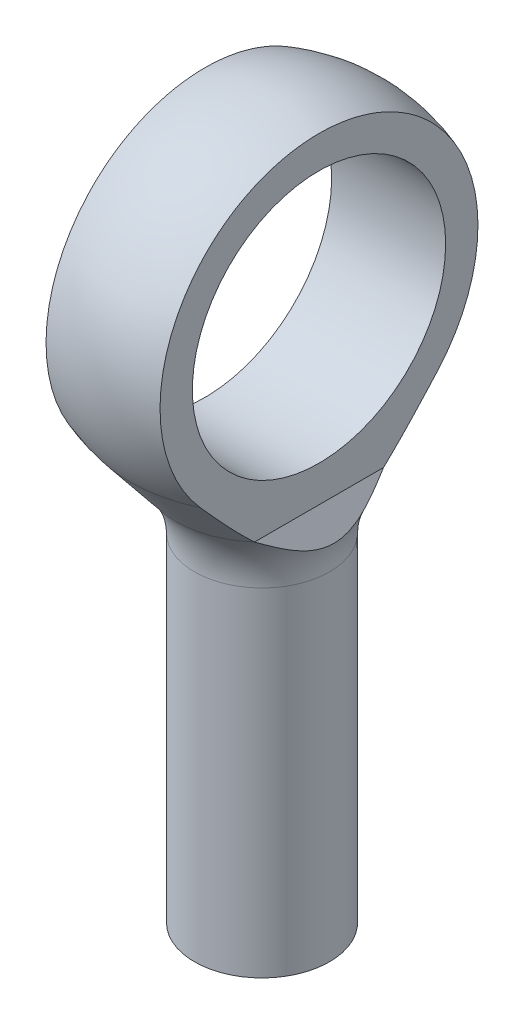
ISO-10303-21;
HEADER;
FILE_DESCRIPTION(('STEP AP214'),'2;1');
FILE_NAME('part.step','',(''),(''),'','','');
FILE_SCHEMA(('AUTOMOTIVE_DESIGN { 1 0 10303 214 1 1 1 1 }'));
ENDSEC;
DATA;
#1=APPLICATION_CONTEXT('core data for automotive mechanical design processes');
#2=APPLICATION_PROTOCOL_DEFINITION('international standard','automotive_design',2000,#1);
#3=PRODUCT_CONTEXT('',#1,'mechanical');
#4=PRODUCT('Part','Part','',(#3));
#5=PRODUCT_RELATED_PRODUCT_CATEGORY('part','',(#4));
#6=PRODUCT_DEFINITION_FORMATION('','',#4);
#7=PRODUCT_DEFINITION_CONTEXT('part definition',#1,'design');
#8=PRODUCT_DEFINITION('design','',#6,#7);
#9=PRODUCT_DEFINITION_SHAPE('','',#8);
#10=(LENGTH_UNIT() NAMED_UNIT(*) SI_UNIT(.MILLI.,.METRE.));
#11=(NAMED_UNIT(*) PLANE_ANGLE_UNIT() SI_UNIT($,.RADIAN.));
#12=(NAMED_UNIT(*) SI_UNIT($,.STERADIAN.) SOLID_ANGLE_UNIT());
#13=UNCERTAINTY_MEASURE_WITH_UNIT(LENGTH_MEASURE(1.E-05),#10,'distance_accuracy_value','');
#14=(GEOMETRIC_REPRESENTATION_CONTEXT(3) GLOBAL_UNCERTAINTY_ASSIGNED_CONTEXT((#13)) GLOBAL_UNIT_ASSIGNED_CONTEXT((#10,
#11,#12)) REPRESENTATION_CONTEXT('',''));
#15=CARTESIAN_POINT('',(0.,0.,0.));
#16=DIRECTION('',(0.,0.,1.));
#17=DIRECTION('',(1.,0.,0.));
#18=AXIS2_PLACEMENT_3D('',#15,#16,#17);
#19=CARTESIAN_POINT('',(0.,20.,0.));
#20=DIRECTION('',(0.,-1.,0.));
#21=DIRECTION('',(0.,0.,-1.));
#22=AXIS2_PLACEMENT_3D('',#19,#20,#21);
#23=TOROIDAL_SURFACE('',#22,9.00000000000001,5.);
#24=CARTESIAN_POINT('',(0.,20.,0.));
#25=DIRECTION('',(0.,-1.,0.));
#26=DIRECTION('',(0.,0.,-1.));
#27=AXIS2_PLACEMENT_3D('',#24,#25,#26);
#28=CIRCLE('',#27,4.);
#29=CARTESIAN_POINT('',(0.,20.,-4.));
#30=VERTEX_POINT('',#29);
#31=EDGE_CURVE('E117',#30,#30,#28,.T.);
#32=ORIENTED_EDGE('',*,*,#31,.F.);
#33=EDGE_LOOP('',(#32));
#34=FACE_BOUND('',#33,.T.);
#35=CARTESIAN_POINT('',(0.,23.1266040101754,0.));
#36=DIRECTION('',(0.,-1.,0.));
#37=DIRECTION('',(0.,0.,-1.));
#38=AXIS2_PLACEMENT_3D('',#35,#36,#37);
#39=CIRCLE('',#38,5.09816102798247);
#40=CARTESIAN_POINT('',(-3.375,23.1266040101754,-3.8210758782363));
#41=VERTEX_POINT('',#40);
#42=CARTESIAN_POINT('',(3.375,23.1266040101754,-3.8210758782363));
#43=VERTEX_POINT('',#42);
#44=EDGE_CURVE('E99',#41,#43,#39,.T.);
#45=ORIENTED_EDGE('',*,*,#44,.T.);
#46=CARTESIAN_POINT('',(3.37488452994616,23.1268040101754,-3.82139169445443));
#47=CARTESIAN_POINT('',(3.41249017782245,23.0616691174022,-3.71851652397559));
#48=CARTESIAN_POINT('',(3.45009264726137,22.9965397298439,-3.61562765823133));
#49=CARTESIAN_POINT('',(3.52489695876208,22.8669748616995,-3.40920546549691));
#50=CARTESIAN_POINT('',(3.56209862787852,22.8025396806634,-3.30567188850496));
#51=CARTESIAN_POINT('',(3.63620425532034,22.6741849688074,-3.09593016847851));
#52=CARTESIAN_POINT('',(3.67309623603228,22.6102861838225,-2.98970497515738));
#53=CARTESIAN_POINT('',(3.7455286134128,22.4848296260864,-2.77543445953144));
#54=CARTESIAN_POINT('',(3.78106917330494,22.4232715706238,-2.66738935932274));
#55=CARTESIAN_POINT('',(3.85199843352389,22.3004184881813,-2.44325946641159));
#56=CARTESIAN_POINT('',(3.88728643457035,22.2392978774713,-2.32704608139777));
#57=CARTESIAN_POINT('',(3.95495503849702,22.122092417393,-2.09120887895792));
#58=CARTESIAN_POINT('',(3.98733493815186,22.0660087860469,-1.97158424580214));
#59=CARTESIAN_POINT('',(4.04804034358767,21.960863939538,-1.72915852017785));
#60=CARTESIAN_POINT('',(4.07638937900855,21.9117619698435,-1.60638125875592));
#61=CARTESIAN_POINT('',(4.12815719037178,21.8220974903657,-1.35677842923676));
#62=CARTESIAN_POINT('',(4.15157995238087,21.7815280765124,-1.22995623052396));
#63=CARTESIAN_POINT('',(4.18730329089335,21.7196534391928,-1.0042557794531));
#64=CARTESIAN_POINT('',(4.20092202565008,21.6960650986593,-0.906214387147233));
#65=CARTESIAN_POINT('',(4.22423689221716,21.6556825651934,-0.708200299966036));
#66=CARTESIAN_POINT('',(4.23393083939658,21.6388921561528,-0.608226561847437));
#67=CARTESIAN_POINT('',(4.24886919463881,21.6130181658917,-0.408523694003785));
#68=CARTESIAN_POINT('',(4.25418002166275,21.6038195436561,-0.308814640528312));
#69=CARTESIAN_POINT('',(4.26036739770318,21.5931026939885,-0.108859294569088));
#70=CARTESIAN_POINT('',(4.26124479024619,21.5915830055258,-0.00861310791666822));
#71=CARTESIAN_POINT('',(4.25852540569128,21.5962931177403,0.191748593784782));
#72=CARTESIAN_POINT('',(4.25492348697454,21.6025318239624,0.291863826376097));
#73=CARTESIAN_POINT('',(4.24339880181696,21.6224931641965,0.491099509379316));
#74=CARTESIAN_POINT('',(4.23547524923607,21.6362171598431,0.590219775456858));
#75=CARTESIAN_POINT('',(4.21548330720657,21.6708442191801,0.788361219680527));
#76=CARTESIAN_POINT('',(4.20335247625208,21.6918554347314,0.88735696676834));
#77=CARTESIAN_POINT('',(4.17544221969617,21.7401974171385,1.08319175936201));
#78=CARTESIAN_POINT('',(4.15966429349354,21.7675255869595,1.18003167328885));
#79=CARTESIAN_POINT('',(4.09891483296068,21.8727467391348,1.51502481873303));
#80=CARTESIAN_POINT('',(4.04565822096029,21.9649898969585,1.74721709218185));
#81=CARTESIAN_POINT('',(3.9564660302895,22.1194753028387,2.08570885380638));
#82=CARTESIAN_POINT('',(3.92508633751298,22.1738265250535,2.19719526072878));
#83=CARTESIAN_POINT('',(3.85994612750983,22.2866526783946,2.41736063382695));
#84=CARTESIAN_POINT('',(3.82618605686691,22.3451268360153,2.52604012141026));
#85=CARTESIAN_POINT('',(3.75863904570073,22.4621216912545,2.73581015913675));
#86=CARTESIAN_POINT('',(3.72493590164482,22.5204972491342,2.83701030853647));
#87=CARTESIAN_POINT('',(3.65641332850057,22.6391818272854,3.03789788982571));
#88=CARTESIAN_POINT('',(3.62159379150606,22.6994910344559,3.13758517410727));
#89=CARTESIAN_POINT('',(3.5516232398074,22.8206835850316,3.33488821335653));
#90=CARTESIAN_POINT('',(3.5164797491661,22.8815538963777,3.43251472101358));
#91=CARTESIAN_POINT('',(3.44585371690543,23.0038817725901,3.62722879866369));
#92=CARTESIAN_POINT('',(3.41037128908788,23.065339140346,3.72431653336598));
#93=CARTESIAN_POINT('',(3.37488452994616,23.1268040101754,3.82139169445443));
#94=B_SPLINE_CURVE_WITH_KNOTS('',3,(#46,#47,#48,#49,#50,#51,#52,#53,#54,#55,#56,#57,#58,#59,#60,
#61,#62,#63,#64,#65,#66,#67,#68,#69,#70,#71,#72,#73,#74,#75,#76,#77,#78,#79,#80,#81,#82,#83,#84,
#85,#86,#87,#88,#89,#90,#91,#92,#93),.UNSPECIFIED.,.F.,.F.,(4,2,2,2,2,2,2,2,2,2,2,2,2,2,2,2,2,2,
2,2,2,2,2,4),(0.,0.382321438557121,0.76480172545589,1.15278314361477,1.54071755186267,
1.94848928358313,2.356359357012,2.76174112279169,3.16679360339243,3.47177805938127,
3.77693204441203,4.07737231574189,4.37775542171082,4.67848364367998,4.97926658879161,
5.28471939686297,5.59004684940858,6.35344962794022,6.73723603259758,7.12095062553061,
7.48570031986673,7.85048537639717,8.21137036356809,8.57213816460872),.UNSPECIFIED.);
#95=CARTESIAN_POINT('',(3.375,23.1266040101754,3.82107587823629));
#96=VERTEX_POINT('',#95);
#97=EDGE_CURVE('E85',#43,#96,#94,.T.);
#98=ORIENTED_EDGE('',*,*,#97,.T.);
#99=CARTESIAN_POINT('',(-3.375,23.1266040101754,3.82107587823629));
#100=VERTEX_POINT('',#99);
#101=EDGE_CURVE('E66',#96,#100,#39,.T.);
#102=ORIENTED_EDGE('',*,*,#101,.T.);
#103=CARTESIAN_POINT('',(-3.37488452994616,23.1268040101754,-3.82139169445443));
#104=CARTESIAN_POINT('',(-3.41249017782245,23.0616691174022,-3.71851652397559));
#105=CARTESIAN_POINT('',(-3.45009264726137,22.9965397298439,-3.61562765823133));
#106=CARTESIAN_POINT('',(-3.52489695876208,22.8669748616995,-3.40920546549691));
#107=CARTESIAN_POINT('',(-3.56209862787852,22.8025396806634,-3.30567188850496));
#108=CARTESIAN_POINT('',(-3.63620425532034,22.6741849688074,-3.09593016847851));
#109=CARTESIAN_POINT('',(-3.67309623603228,22.6102861838225,-2.98970497515738));
#110=CARTESIAN_POINT('',(-3.7455286134128,22.4848296260864,-2.77543445953145));
#111=CARTESIAN_POINT('',(-3.78106917330494,22.4232715706238,-2.66738935932274));
#112=CARTESIAN_POINT('',(-3.85199843352389,22.3004184881813,-2.44325946641159));
#113=CARTESIAN_POINT('',(-3.88728643457035,22.2392978774713,-2.32704608139778));
#114=CARTESIAN_POINT('',(-3.95495503849702,22.122092417393,-2.09120887895792));
#115=CARTESIAN_POINT('',(-3.98733493815186,22.0660087860469,-1.97158424580215));
#116=CARTESIAN_POINT('',(-4.04804034358767,21.960863939538,-1.72915852017786));
#117=CARTESIAN_POINT('',(-4.07638937900855,21.9117619698435,-1.60638125875592));
#118=CARTESIAN_POINT('',(-4.12815719037178,21.8220974903657,-1.35677842923676));
#119=CARTESIAN_POINT('',(-4.15157995238087,21.7815280765124,-1.22995623052396));
#120=CARTESIAN_POINT('',(-4.18730329089335,21.7196534391928,-1.0042557794531));
#121=CARTESIAN_POINT('',(-4.20092202565008,21.6960650986593,-0.906214387147233));
#122=CARTESIAN_POINT('',(-4.22423689221716,21.6556825651934,-0.708200299966037));
#123=CARTESIAN_POINT('',(-4.23393083939658,21.6388921561528,-0.608226561847438));
#124=CARTESIAN_POINT('',(-4.24886919463881,21.6130181658917,-0.408523694003786));
#125=CARTESIAN_POINT('',(-4.25418002166275,21.6038195436561,-0.308814640528312));
#126=CARTESIAN_POINT('',(-4.26036739770318,21.5931026939885,-0.108859294569089));
#127=CARTESIAN_POINT('',(-4.26124479024619,21.5915830055258,-0.00861310791666912));
#128=CARTESIAN_POINT('',(-4.25852540569128,21.5962931177403,0.191748593784781));
#129=CARTESIAN_POINT('',(-4.25492348697454,21.6025318239624,0.291863826376095));
#130=CARTESIAN_POINT('',(-4.24339880181696,21.6224931641965,0.491099509379314));
#131=CARTESIAN_POINT('',(-4.23547524923607,21.6362171598431,0.590219775456857));
#132=CARTESIAN_POINT('',(-4.21548330720657,21.6708442191801,0.788361219680527));
#133=CARTESIAN_POINT('',(-4.20335247625208,21.6918554347314,0.88735696676834));
#134=CARTESIAN_POINT('',(-4.17544221969617,21.7401974171385,1.08319175936201));
#135=CARTESIAN_POINT('',(-4.15966429349354,21.7675255869595,1.18003167328885));
#136=CARTESIAN_POINT('',(-4.09891483296068,21.8727467391348,1.51502481873303));
#137=CARTESIAN_POINT('',(-4.04565822096029,21.9649898969585,1.74721709218185));
#138=CARTESIAN_POINT('',(-3.9564660302895,22.1194753028387,2.08570885380638));
#139=CARTESIAN_POINT('',(-3.92508633751298,22.1738265250535,2.19719526072878));
#140=CARTESIAN_POINT('',(-3.85994612750983,22.2866526783946,2.41736063382695));
#141=CARTESIAN_POINT('',(-3.82618605686691,22.3451268360153,2.52604012141026));
#142=CARTESIAN_POINT('',(-3.75863904570073,22.4621216912545,2.73581015913675));
#143=CARTESIAN_POINT('',(-3.72493590164482,22.5204972491342,2.83701030853647));
#144=CARTESIAN_POINT('',(-3.65641332850057,22.6391818272854,3.03789788982571));
#145=CARTESIAN_POINT('',(-3.62159379150606,22.6994910344559,3.13758517410727));
#146=CARTESIAN_POINT('',(-3.5516232398074,22.8206835850316,3.33488821335653));
#147=CARTESIAN_POINT('',(-3.5164797491661,22.8815538963777,3.43251472101358));
#148=CARTESIAN_POINT('',(-3.44585371690542,23.0038817725901,3.62722879866369));
#149=CARTESIAN_POINT('',(-3.41037128908788,23.065339140346,3.72431653336598));
#150=CARTESIAN_POINT('',(-3.37488452994616,23.1268040101754,3.82139169445443));
#151=B_SPLINE_CURVE_WITH_KNOTS('',3,(#103,#104,#105,#106,#107,#108,#109,#110,#111,#112,#113,
#114,#115,#116,#117,#118,#119,#120,#121,#122,#123,#124,#125,#126,#127,#128,#129,#130,#131,#132,
#133,#134,#135,#136,#137,#138,#139,#140,#141,#142,#143,#144,#145,#146,#147,#148,#149,#150),
.UNSPECIFIED.,.F.,.F.,(4,2,2,2,2,2,2,2,2,2,2,2,2,2,2,2,2,2,2,2,2,2,2,4),(0.,0.382321438557118,
0.764801725455888,1.15278314361477,1.54071755186267,1.94848928358313,2.356359357012,
2.76174112279169,3.16679360339243,3.47177805938127,3.77693204441203,4.07737231574189,
4.37775542171082,4.67848364367998,4.97926658879161,5.28471939686298,5.59004684940859,
6.35344962794022,6.73723603259758,7.12095062553062,7.48570031986673,7.85048537639717,
8.21137036356809,8.57213816460872),.UNSPECIFIED.);
#152=EDGE_CURVE('E103',#41,#100,#151,.T.);
#153=ORIENTED_EDGE('',*,*,#152,.F.);
#154=EDGE_LOOP('',(#45,#98,#102,#153));
#155=FACE_BOUND('',#154,.T.);
#156=ADVANCED_FACE('F38',(#34,#155),#23,.F.);
#157=CARTESIAN_POINT('',(0.,32.7561562391792,0.));
#158=DIRECTION('',(0.,-1.,0.));
#159=DIRECTION('',(1.,0.,0.));
#160=AXIS2_PLACEMENT_3D('',#157,#158,#159);
#161=SPHERICAL_SURFACE('',#160,10.);
#162=CARTESIAN_POINT('',(3.375,32.7561562391792,0.));
#163=DIRECTION('',(1.,0.,0.));
#164=DIRECTION('',(0.,1.,0.));
#165=AXIS2_PLACEMENT_3D('',#162,#163,#164);
#166=CIRCLE('',#165,9.41325528178218);
#167=CARTESIAN_POINT('',(3.375,26.5029482188283,-7.03610435214114));
#168=VERTEX_POINT('',#167);
#169=CARTESIAN_POINT('',(3.375,26.5029482188283,7.03610435214114));
#170=VERTEX_POINT('',#169);
#171=EDGE_CURVE('E58',#168,#170,#166,.T.);
#172=ORIENTED_EDGE('',*,*,#171,.F.);
#173=CARTESIAN_POINT('',(0.,26.5029482188283,0.));
#174=DIRECTION('',(0.,-1.,0.));
#175=DIRECTION('',(0.,0.,-1.));
#176=AXIS2_PLACEMENT_3D('',#173,#174,#175);
#177=CIRCLE('',#176,7.80367794403507);
#178=CARTESIAN_POINT('',(-3.375,26.5029482188283,-7.03610435214114));
#179=VERTEX_POINT('',#178);
#180=EDGE_CURVE('E101',#179,#168,#177,.T.);
#181=ORIENTED_EDGE('',*,*,#180,.F.);
#182=CARTESIAN_POINT('',(-3.375,32.7561562391792,0.));
#183=DIRECTION('',(1.,0.,0.));
#184=DIRECTION('',(0.,0.,-1.));
#185=AXIS2_PLACEMENT_3D('',#182,#183,#184);
#186=CIRCLE('',#185,9.41325528178218);
#187=CARTESIAN_POINT('',(-3.375,26.5029482188283,7.03610435214114));
#188=VERTEX_POINT('',#187);
#189=EDGE_CURVE('E170',#179,#188,#186,.T.);
#190=ORIENTED_EDGE('',*,*,#189,.T.);
#191=EDGE_CURVE('E104',#170,#188,#177,.T.);
#192=ORIENTED_EDGE('',*,*,#191,.F.);
#193=EDGE_LOOP('',(#172,#181,#190,#192));
#194=FACE_BOUND('',#193,.T.);
#195=ADVANCED_FACE('F146',(#194),#161,.T.);
#196=CARTESIAN_POINT('',(0.,23.1266040101754,0.));
#197=DIRECTION('',(0.,1.,0.));
#198=DIRECTION('',(0.,0.,1.));
#199=AXIS2_PLACEMENT_3D('',#196,#197,#198);
#200=CONICAL_SURFACE('',#199,5.09816102798247,0.675542556079665);
#201=ORIENTED_EDGE('',*,*,#180,.T.);
#202=CARTESIAN_POINT('',(3.375,36.0841780638703,-15.1089035653844));
#203=CARTESIAN_POINT('',(3.375,35.594888710274,-14.7071353004907));
#204=CARTESIAN_POINT('',(3.375,35.1059438134564,-14.3049458521356));
#205=CARTESIAN_POINT('',(3.375,34.1286133997418,-13.4990655933055));
#206=CARTESIAN_POINT('',(3.375,33.6402286801944,-13.0953738160659));
#207=CARTESIAN_POINT('',(3.375,32.6564250570084,-12.2796326022027));
#208=CARTESIAN_POINT('',(3.375,32.1610273720674,-11.8675575598882));
#209=CARTESIAN_POINT('',(3.375,31.1723724363193,-11.0416661111337));
#210=CARTESIAN_POINT('',(3.375,30.6791137645754,-10.6278514076651));
#211=CARTESIAN_POINT('',(3.375,29.8208589145688,-9.90353244524927));
#212=CARTESIAN_POINT('',(3.375,29.4553203005688,-9.59367126412202));
#213=CARTESIAN_POINT('',(3.375,28.7260284069905,-8.97185582291749));
#214=CARTESIAN_POINT('',(3.375,28.3622751185766,-8.65990157321673));
#215=CARTESIAN_POINT('',(3.375,27.636106230119,-8.03224096612243));
#216=CARTESIAN_POINT('',(3.375,27.2736979322941,-7.7165261517913));
#217=CARTESIAN_POINT('',(3.375,26.5524146478876,-7.08127660677713));
#218=CARTESIAN_POINT('',(3.375,26.1935386807542,-6.76174299401533));
#219=CARTESIAN_POINT('',(3.375,25.661407529814,-6.28030472573748));
#220=CARTESIAN_POINT('',(3.375,25.4862127876472,-6.12054469421635));
#221=CARTESIAN_POINT('',(3.375,25.1373896508185,-5.79932531401072));
#222=CARTESIAN_POINT('',(3.375,24.9637612371941,-5.6378659859499));
#223=CARTESIAN_POINT('',(3.375,24.6182757864564,-5.31265601217773));
#224=CARTESIAN_POINT('',(3.375,24.4464210644897,-5.14890290229314));
#225=CARTESIAN_POINT('',(3.375,24.1052781895209,-4.81875896178374));
#226=CARTESIAN_POINT('',(3.375,23.9359898818113,-4.65236829140227));
#227=CARTESIAN_POINT('',(3.375,23.6017182733847,-4.31712795495181));
#228=CARTESIAN_POINT('',(3.375,23.4367163845775,-4.14829690210438));
#229=CARTESIAN_POINT('',(3.375,23.1112288881222,-3.80623309876129));
#230=CARTESIAN_POINT('',(3.375,22.950744527057,-3.63299915793071));
#231=CARTESIAN_POINT('',(3.375,22.6364955307666,-3.28109676369821));
#232=CARTESIAN_POINT('',(3.375,22.4827179654647,-3.10244000606245));
#233=CARTESIAN_POINT('',(3.375,22.2592126818346,-2.8286812127181));
#234=CARTESIAN_POINT('',(3.375,22.1859215126204,-2.73648930084127));
#235=CARTESIAN_POINT('',(3.375,22.0422957430342,-2.54983660741675));
#236=CARTESIAN_POINT('',(3.375,21.9719607054645,-2.45537616464415));
#237=CARTESIAN_POINT('',(3.375,21.8655035085235,-2.30649378730431));
#238=CARTESIAN_POINT('',(3.375,21.8281012153899,-2.25298583752597));
#239=CARTESIAN_POINT('',(3.375,21.7545843239063,-2.14507468160288));
#240=CARTESIAN_POINT('',(3.375,21.7184699857126,-2.09067129779502));
#241=CARTESIAN_POINT('',(3.375,21.6477101495667,-1.9808937826975));
#242=CARTESIAN_POINT('',(3.375,21.6130650451705,-1.92551939685534));
#243=CARTESIAN_POINT('',(3.375,21.5454738839284,-1.81374733690107));
#244=CARTESIAN_POINT('',(3.375,21.5125277755857,-1.75734969387419));
#245=CARTESIAN_POINT('',(3.375,21.4173704192886,-1.58788962759254));
#246=CARTESIAN_POINT('',(3.375,21.3579648118696,-1.47322216610759));
#247=CARTESIAN_POINT('',(3.375,21.249095239293,-1.23923244991424));
#248=CARTESIAN_POINT('',(3.375,21.1996264536709,-1.1199124858974));
#249=CARTESIAN_POINT('',(3.375,21.1291327754218,-0.920762708506683));
#250=CARTESIAN_POINT('',(3.375,21.104295200606,-0.842282649796587));
#251=CARTESIAN_POINT('',(3.375,21.0606488944243,-0.683661864194235));
#252=CARTESIAN_POINT('',(3.375,21.0418387060537,-0.603521543632725));
#253=CARTESIAN_POINT('',(3.375,21.0110013676514,-0.442069057815007));
#254=CARTESIAN_POINT('',(3.375,20.9989630588981,-0.360759048114567));
#255=CARTESIAN_POINT('',(3.375,20.9821623971586,-0.197379180939449));
#256=CARTESIAN_POINT('',(3.375,20.9774001639361,-0.115309310979881));
#257=CARTESIAN_POINT('',(3.375,20.9753813283989,0.0492061499280861));
#258=CARTESIAN_POINT('',(3.375,20.9781505527759,0.131652063400023));
#259=CARTESIAN_POINT('',(3.375,20.9911122637069,0.295949988005775));
#260=CARTESIAN_POINT('',(3.375,21.00130477032,0.377801997534154));
#261=CARTESIAN_POINT('',(3.375,21.0286622172135,0.54046220193734));
#262=CARTESIAN_POINT('',(3.375,21.0458390033777,0.62126838154292));
#263=CARTESIAN_POINT('',(3.375,21.0864607586875,0.781279698631002));
#264=CARTESIAN_POINT('',(3.375,21.1099067173972,0.860484581230275));
#265=CARTESIAN_POINT('',(3.375,21.1769927440503,1.06108550067913));
#266=CARTESIAN_POINT('',(3.375,21.2245750503509,1.1811645283064));
#267=CARTESIAN_POINT('',(3.375,21.3301216307895,1.41665989940712));
#268=CARTESIAN_POINT('',(3.375,21.3880936420274,1.53207268894256));
#269=CARTESIAN_POINT('',(3.375,21.5122088646592,1.7590359463292));
#270=CARTESIAN_POINT('',(3.375,21.5783868814839,1.87056720181557));
#271=CARTESIAN_POINT('',(3.375,21.6821872804666,2.03492810001569));
#272=CARTESIAN_POINT('',(3.375,21.7175372776027,2.08921773343231));
#273=CARTESIAN_POINT('',(3.375,21.789573425245,2.19690232584506));
#274=CARTESIAN_POINT('',(3.375,21.8262595402376,2.25029730856564));
#275=CARTESIAN_POINT('',(3.375,21.9392493266842,2.41092138459102));
#276=CARTESIAN_POINT('',(3.375,22.0173825029715,2.51686498191268));
#277=CARTESIAN_POINT('',(3.375,22.1773971401022,2.72589313035675));
#278=CARTESIAN_POINT('',(3.375,22.2592793589632,2.82897709646492));
#279=CARTESIAN_POINT('',(3.375,22.4260520634644,3.03279341491357));
#280=CARTESIAN_POINT('',(3.375,22.5109445828988,3.1335240980822));
#281=CARTESIAN_POINT('',(3.375,22.683104290418,3.33293957138482));
#282=CARTESIAN_POINT('',(3.375,22.7703716429206,3.4316242190271));
#283=CARTESIAN_POINT('',(3.375,23.0354629984658,3.72555402652137));
#284=CARTESIAN_POINT('',(3.375,23.2161748413057,3.91819327059077));
#285=CARTESIAN_POINT('',(3.375,23.5828379441553,4.29841993974596));
#286=CARTESIAN_POINT('',(3.375,23.7687898672805,4.48600671953062));
#287=CARTESIAN_POINT('',(3.375,24.0511912454461,4.76516729366284));
#288=CARTESIAN_POINT('',(3.375,24.1462371836613,4.85816713693076));
#289=CARTESIAN_POINT('',(3.375,24.3371461065,5.04331158123552));
#290=CARTESIAN_POINT('',(3.375,24.4330090362599,5.13545623884616));
#291=CARTESIAN_POINT('',(3.375,24.7216784084189,5.41079993582398));
#292=CARTESIAN_POINT('',(3.375,24.9155445320198,5.59288813900417));
#293=CARTESIAN_POINT('',(3.375,25.3050821665637,5.95444319747687));
#294=CARTESIAN_POINT('',(3.375,25.5007500175822,6.13391400754733));
#295=CARTESIAN_POINT('',(3.375,25.8937557270929,6.49101743423798));
#296=CARTESIAN_POINT('',(3.375,26.0910935938291,6.6686500417745));
#297=CARTESIAN_POINT('',(3.375,26.6931905774145,7.20658863841854));
#298=CARTESIAN_POINT('',(3.375,27.1000293896574,7.56456556900533));
#299=CARTESIAN_POINT('',(3.375,27.9172953520381,8.27640785174864));
#300=CARTESIAN_POINT('',(3.375,28.3277226097476,8.63027307990196));
#301=CARTESIAN_POINT('',(3.375,29.1513872491248,9.33533609734642));
#302=CARTESIAN_POINT('',(3.375,29.5646264895762,9.68653171309727));
#303=CARTESIAN_POINT('',(3.375,30.3929211016791,10.3867746796274));
#304=CARTESIAN_POINT('',(3.375,30.8079764791403,10.7358220235261));
#305=CARTESIAN_POINT('',(3.375,31.6270352017182,11.4218964462194));
#306=CARTESIAN_POINT('',(3.375,32.0309985682995,11.7589712836173));
#307=CARTESIAN_POINT('',(3.375,32.8399179410271,12.4319305983335));
#308=CARTESIAN_POINT('',(3.375,33.2448739512556,12.7678150707425));
#309=CARTESIAN_POINT('',(3.375,34.0551987421529,13.4383354034095));
#310=CARTESIAN_POINT('',(3.375,34.4605668141227,13.7729721205002));
#311=CARTESIAN_POINT('',(3.375,35.2719343943417,14.4414732980168));
#312=CARTESIAN_POINT('',(3.375,35.6779338979961,14.7753377640185));
#313=CARTESIAN_POINT('',(3.375,36.0841780638703,15.1089035653844));
#314=B_SPLINE_CURVE_WITH_KNOTS('',3,(#202,#203,#204,#205,#206,#207,#208,#209,#210,#211,#212,
#213,#214,#215,#216,#217,#218,#219,#220,#221,#222,#223,#224,#225,#226,#227,#228,#229,#230,#231,
#232,#233,#234,#235,#236,#237,#238,#239,#240,#241,#242,#243,#244,#245,#246,#247,#248,#249,#250,
#251,#252,#253,#254,#255,#256,#257,#258,#259,#260,#261,#262,#263,#264,#265,#266,#267,#268,#269,
#270,#271,#272,#273,#274,#275,#276,#277,#278,#279,#280,#281,#282,#283,#284,#285,#286,#287,#288,
#289,#290,#291,#292,#293,#294,#295,#296,#297,#298,#299,#300,#301,#302,#303,#304,#305,#306,#307,
#308,#309,#310,#311,#312,#313),.UNSPECIFIED.,.F.,.F.,(4,2,2,2,2,2,2,2,2,2,2,2,2,2,2,2,2,2,2,2,2,
2,2,2,2,2,2,2,2,2,2,2,2,2,2,2,2,2,2,2,2,2,2,2,2,2,2,2,2,2,2,2,2,2,2,4),(0.,1.89931609103301,
3.8002033869621,5.73333744708498,7.66488795811481,9.10248175602742,10.5400684322327,
11.9819741441709,13.4234676149061,14.1347594184043,14.8460425991805,15.5581595997778,
16.2702335007213,16.9783817981901,17.6867236262507,18.393633312113,18.7469150760631,
19.1001444061479,19.2959816365794,19.4918582030308,19.6877869107205,19.8837096762824,
20.2707677413331,20.6576375842556,20.9043861404837,21.1510750049235,21.3973561750243,
21.6436413988564,21.8907722419039,22.1379037527442,22.3854561780511,22.6330477016241,
23.0198493405871,23.4069402325339,23.7957330354016,23.9900705673726,24.1844029376946,
24.5792013388178,24.9740799196611,25.3692305677052,25.7644086433423,26.5566446560589,
27.3489813779632,27.7479057197944,28.146803480412,28.9446869481257,29.7412041515137,
30.5377252890985,32.1634035103732,33.7891306332341,35.4160637783811,37.0430021317119,
38.6213694992568,40.199743368814,41.7766840313629,43.3536132722441),.UNSPECIFIED.);
#315=EDGE_CURVE('E12',#168,#43,#314,.T.);
#316=ORIENTED_EDGE('',*,*,#315,.T.);
#317=ORIENTED_EDGE('',*,*,#44,.F.);
#318=CARTESIAN_POINT('',(-3.375,36.0841780638703,-15.1089035653844));
#319=CARTESIAN_POINT('',(-3.375,35.594888710274,-14.7071353004907));
#320=CARTESIAN_POINT('',(-3.375,35.1059438134565,-14.3049458521356));
#321=CARTESIAN_POINT('',(-3.375,34.1286133997418,-13.4990655933055));
#322=CARTESIAN_POINT('',(-3.375,33.6402286801944,-13.0953738160659));
#323=CARTESIAN_POINT('',(-3.375,32.6564250570084,-12.2796326022027));
#324=CARTESIAN_POINT('',(-3.375,32.1610273720674,-11.8675575598882));
#325=CARTESIAN_POINT('',(-3.375,31.1723724363193,-11.0416661111337));
#326=CARTESIAN_POINT('',(-3.375,30.6791137645754,-10.6278514076651));
#327=CARTESIAN_POINT('',(-3.375,29.8208589145688,-9.90353244524927));
#328=CARTESIAN_POINT('',(-3.375,29.4553203005688,-9.59367126412202));
#329=CARTESIAN_POINT('',(-3.375,28.7260284069905,-8.97185582291749));
#330=CARTESIAN_POINT('',(-3.375,28.3622751185766,-8.65990157321673));
#331=CARTESIAN_POINT('',(-3.375,27.636106230119,-8.03224096612243));
#332=CARTESIAN_POINT('',(-3.375,27.2736979322941,-7.7165261517913));
#333=CARTESIAN_POINT('',(-3.375,26.5524146478876,-7.08127660677713));
#334=CARTESIAN_POINT('',(-3.375,26.1935386807542,-6.76174299401533));
#335=CARTESIAN_POINT('',(-3.375,25.661407529814,-6.28030472573749));
#336=CARTESIAN_POINT('',(-3.375,25.4862127876472,-6.12054469421635));
#337=CARTESIAN_POINT('',(-3.375,25.1373896508185,-5.79932531401073));
#338=CARTESIAN_POINT('',(-3.375,24.9637612371941,-5.6378659859499));
#339=CARTESIAN_POINT('',(-3.375,24.6182757864564,-5.31265601217773));
#340=CARTESIAN_POINT('',(-3.375,24.4464210644897,-5.14890290229315));
#341=CARTESIAN_POINT('',(-3.375,24.1052781895209,-4.81875896178375));
#342=CARTESIAN_POINT('',(-3.375,23.9359898818113,-4.65236829140227));
#343=CARTESIAN_POINT('',(-3.375,23.6017182733847,-4.31712795495181));
#344=CARTESIAN_POINT('',(-3.375,23.4367163845775,-4.14829690210438));
#345=CARTESIAN_POINT('',(-3.375,23.1112288881222,-3.80623309876129));
#346=CARTESIAN_POINT('',(-3.375,22.950744527057,-3.63299915793071));
#347=CARTESIAN_POINT('',(-3.375,22.6364955307666,-3.28109676369821));
#348=CARTESIAN_POINT('',(-3.375,22.4827179654647,-3.10244000606245));
#349=CARTESIAN_POINT('',(-3.375,22.2592126818346,-2.8286812127181));
#350=CARTESIAN_POINT('',(-3.375,22.1859215126204,-2.73648930084127));
#351=CARTESIAN_POINT('',(-3.375,22.0422957430342,-2.54983660741675));
#352=CARTESIAN_POINT('',(-3.375,21.9719607054645,-2.45537616464415));
#353=CARTESIAN_POINT('',(-3.375,21.8655035085235,-2.30649378730431));
#354=CARTESIAN_POINT('',(-3.375,21.8281012153899,-2.25298583752597));
#355=CARTESIAN_POINT('',(-3.375,21.7545843239063,-2.14507468160288));
#356=CARTESIAN_POINT('',(-3.375,21.7184699857126,-2.09067129779502));
#357=CARTESIAN_POINT('',(-3.375,21.6477101495667,-1.98089378269751));
#358=CARTESIAN_POINT('',(-3.375,21.6130650451705,-1.92551939685534));
#359=CARTESIAN_POINT('',(-3.375,21.5454738839284,-1.81374733690107));
#360=CARTESIAN_POINT('',(-3.375,21.5125277755857,-1.75734969387419));
#361=CARTESIAN_POINT('',(-3.375,21.4173704192886,-1.58788962759254));
#362=CARTESIAN_POINT('',(-3.375,21.3579648118696,-1.47322216610759));
#363=CARTESIAN_POINT('',(-3.375,21.249095239293,-1.23923244991424));
#364=CARTESIAN_POINT('',(-3.375,21.1996264536709,-1.1199124858974));
#365=CARTESIAN_POINT('',(-3.375,21.1291327754218,-0.920762708506684));
#366=CARTESIAN_POINT('',(-3.375,21.104295200606,-0.842282649796588));
#367=CARTESIAN_POINT('',(-3.375,21.0606488944243,-0.683661864194236));
#368=CARTESIAN_POINT('',(-3.375,21.0418387060537,-0.603521543632726));
#369=CARTESIAN_POINT('',(-3.375,21.0110013676514,-0.442069057815008));
#370=CARTESIAN_POINT('',(-3.375,20.9989630588981,-0.360759048114568));
#371=CARTESIAN_POINT('',(-3.375,20.9821623971586,-0.19737918093945));
#372=CARTESIAN_POINT('',(-3.375,20.9774001639361,-0.115309310979882));
#373=CARTESIAN_POINT('',(-3.375,20.9753813283989,0.0492061499280856));
#374=CARTESIAN_POINT('',(-3.375,20.9781505527759,0.131652063400023));
#375=CARTESIAN_POINT('',(-3.375,20.9911122637069,0.295949988005775));
#376=CARTESIAN_POINT('',(-3.375,21.00130477032,0.377801997534154));
#377=CARTESIAN_POINT('',(-3.375,21.0286622172135,0.54046220193734));
#378=CARTESIAN_POINT('',(-3.375,21.0458390033777,0.62126838154292));
#379=CARTESIAN_POINT('',(-3.375,21.0864607586875,0.781279698631002));
#380=CARTESIAN_POINT('',(-3.375,21.1099067173972,0.860484581230275));
#381=CARTESIAN_POINT('',(-3.375,21.1769927440503,1.06108550067913));
#382=CARTESIAN_POINT('',(-3.375,21.2245750503509,1.1811645283064));
#383=CARTESIAN_POINT('',(-3.375,21.3301216307895,1.41665989940712));
#384=CARTESIAN_POINT('',(-3.375,21.3880936420274,1.53207268894256));
#385=CARTESIAN_POINT('',(-3.375,21.5122088646592,1.7590359463292));
#386=CARTESIAN_POINT('',(-3.375,21.5783868814839,1.87056720181558));
#387=CARTESIAN_POINT('',(-3.375,21.6821872804666,2.03492810001569));
#388=CARTESIAN_POINT('',(-3.375,21.7175372776027,2.08921773343231));
#389=CARTESIAN_POINT('',(-3.375,21.789573425245,2.19690232584506));
#390=CARTESIAN_POINT('',(-3.375,21.8262595402376,2.25029730856564));
#391=CARTESIAN_POINT('',(-3.375,21.9392493266842,2.41092138459102));
#392=CARTESIAN_POINT('',(-3.375,22.0173825029715,2.51686498191269));
#393=CARTESIAN_POINT('',(-3.375,22.1773971401022,2.72589313035675));
#394=CARTESIAN_POINT('',(-3.375,22.2592793589632,2.82897709646492));
#395=CARTESIAN_POINT('',(-3.375,22.4260520634644,3.03279341491357));
#396=CARTESIAN_POINT('',(-3.375,22.5109445828988,3.1335240980822));
#397=CARTESIAN_POINT('',(-3.375,22.683104290418,3.33293957138482));
#398=CARTESIAN_POINT('',(-3.375,22.7703716429206,3.4316242190271));
#399=CARTESIAN_POINT('',(-3.375,23.0354629984658,3.72555402652137));
#400=CARTESIAN_POINT('',(-3.375,23.2161748413057,3.91819327059078));
#401=CARTESIAN_POINT('',(-3.375,23.5828379441553,4.29841993974596));
#402=CARTESIAN_POINT('',(-3.375,23.7687898672805,4.48600671953062));
#403=CARTESIAN_POINT('',(-3.375,24.0511912454461,4.76516729366284));
#404=CARTESIAN_POINT('',(-3.375,24.1462371836613,4.85816713693076));
#405=CARTESIAN_POINT('',(-3.375,24.3371461065,5.04331158123553));
#406=CARTESIAN_POINT('',(-3.375,24.4330090362599,5.13545623884616));
#407=CARTESIAN_POINT('',(-3.375,24.7216784084189,5.41079993582398));
#408=CARTESIAN_POINT('',(-3.375,24.9155445320198,5.59288813900418));
#409=CARTESIAN_POINT('',(-3.375,25.3050821665638,5.95444319747688));
#410=CARTESIAN_POINT('',(-3.375,25.5007500175822,6.13391400754734));
#411=CARTESIAN_POINT('',(-3.375,25.8937557270929,6.49101743423799));
#412=CARTESIAN_POINT('',(-3.375,26.0910935938291,6.6686500417745));
#413=CARTESIAN_POINT('',(-3.375,26.6931905774145,7.20658863841854));
#414=CARTESIAN_POINT('',(-3.375,27.1000293896574,7.56456556900534));
#415=CARTESIAN_POINT('',(-3.375,27.9172953520381,8.27640785174864));
#416=CARTESIAN_POINT('',(-3.375,28.3277226097476,8.63027307990196));
#417=CARTESIAN_POINT('',(-3.375,29.1513872491248,9.33533609734643));
#418=CARTESIAN_POINT('',(-3.375,29.5646264895762,9.68653171309728));
#419=CARTESIAN_POINT('',(-3.375,30.3929211016791,10.3867746796274));
#420=CARTESIAN_POINT('',(-3.375,30.8079764791403,10.7358220235261));
#421=CARTESIAN_POINT('',(-3.375,31.6270352017182,11.4218964462194));
#422=CARTESIAN_POINT('',(-3.375,32.0309985682996,11.7589712836173));
#423=CARTESIAN_POINT('',(-3.375,32.8399179410271,12.4319305983335));
#424=CARTESIAN_POINT('',(-3.375,33.2448739512556,12.7678150707425));
#425=CARTESIAN_POINT('',(-3.375,34.0551987421529,13.4383354034095));
#426=CARTESIAN_POINT('',(-3.375,34.4605668141227,13.7729721205002));
#427=CARTESIAN_POINT('',(-3.375,35.2719343943417,14.4414732980168));
#428=CARTESIAN_POINT('',(-3.375,35.6779338979961,14.7753377640185));
#429=CARTESIAN_POINT('',(-3.375,36.0841780638703,15.1089035653844));
#430=B_SPLINE_CURVE_WITH_KNOTS('',3,(#318,#319,#320,#321,#322,#323,#324,#325,#326,#327,#328,
#329,#330,#331,#332,#333,#334,#335,#336,#337,#338,#339,#340,#341,#342,#343,#344,#345,#346,#347,
#348,#349,#350,#351,#352,#353,#354,#355,#356,#357,#358,#359,#360,#361,#362,#363,#364,#365,#366,
#367,#368,#369,#370,#371,#372,#373,#374,#375,#376,#377,#378,#379,#380,#381,#382,#383,#384,#385,
#386,#387,#388,#389,#390,#391,#392,#393,#394,#395,#396,#397,#398,#399,#400,#401,#402,#403,#404,
#405,#406,#407,#408,#409,#410,#411,#412,#413,#414,#415,#416,#417,#418,#419,#420,#421,#422,#423,
#424,#425,#426,#427,#428,#429),.UNSPECIFIED.,.F.,.F.,(4,2,2,2,2,2,2,2,2,2,2,2,2,2,2,2,2,2,2,2,2,
2,2,2,2,2,2,2,2,2,2,2,2,2,2,2,2,2,2,2,2,2,2,2,2,2,2,2,2,2,2,2,2,2,2,4),(0.,1.89931609103299,
3.8002033869621,5.73333744708498,7.6648879581148,9.10248175602741,10.5400684322327,
11.9819741441709,13.4234676149061,14.1347594184043,14.8460425991805,15.5581595997778,
16.2702335007213,16.9783817981901,17.6867236262507,18.3936333121131,18.7469150760631,
19.1001444061479,19.2959816365794,19.4918582030308,19.6877869107205,19.8837096762824,
20.2707677413331,20.6576375842556,20.9043861404837,21.1510750049235,21.3973561750242,
21.6436413988564,21.8907722419039,22.1379037527442,22.3854561780511,22.6330477016241,
23.0198493405872,23.4069402325339,23.7957330354016,23.9900705673726,24.1844029376946,
24.5792013388178,24.9740799196612,25.3692305677052,25.7644086433423,26.5566446560589,
27.3489813779632,27.7479057197945,28.146803480412,28.9446869481257,29.7412041515137,
30.5377252890986,32.1634035103732,33.7891306332341,35.4160637783811,37.0430021317119,
38.6213694992568,40.199743368814,41.7766840313629,43.3536132722441),.UNSPECIFIED.);
#431=EDGE_CURVE('E125',#179,#41,#430,.T.);
#432=ORIENTED_EDGE('',*,*,#431,.F.);
#433=EDGE_LOOP('',(#201,#316,#317,#432));
#434=FACE_BOUND('',#433,.T.);
#435=ADVANCED_FACE('F97',(#434),#200,.T.);
#436=ORIENTED_EDGE('',*,*,#101,.F.);
#437=EDGE_CURVE('E42',#96,#170,#314,.T.);
#438=ORIENTED_EDGE('',*,*,#437,.T.);
#439=ORIENTED_EDGE('',*,*,#191,.T.);
#440=EDGE_CURVE('E119',#100,#188,#430,.T.);
#441=ORIENTED_EDGE('',*,*,#440,.F.);
#442=EDGE_LOOP('',(#436,#438,#439,#441));
#443=FACE_BOUND('',#442,.T.);
#444=ADVANCED_FACE('F156',(#443),#200,.T.);
#445=CARTESIAN_POINT('',(0.,0.,0.));
#446=DIRECTION('',(0.,-1.,0.));
#447=DIRECTION('',(0.,0.,-1.));
#448=AXIS2_PLACEMENT_3D('',#445,#446,#447);
#449=CYLINDRICAL_SURFACE('',#448,4.);
#450=ORIENTED_EDGE('',*,*,#31,.T.);
#451=EDGE_LOOP('',(#450));
#452=FACE_BOUND('',#451,.T.);
#453=CARTESIAN_POINT('',(0.,0.,0.));
#454=DIRECTION('',(0.,-1.,0.));
#455=DIRECTION('',(0.,0.,-1.));
#456=AXIS2_PLACEMENT_3D('',#453,#454,#455);
#457=CIRCLE('',#456,4.);
#458=CARTESIAN_POINT('',(0.,0.,-4.));
#459=VERTEX_POINT('',#458);
#460=EDGE_CURVE('E114',#459,#459,#457,.T.);
#461=ORIENTED_EDGE('',*,*,#460,.F.);
#462=EDGE_LOOP('',(#461));
#463=FACE_BOUND('',#462,.T.);
#464=ADVANCED_FACE('F142',(#452,#463),#449,.T.);
#465=CARTESIAN_POINT('',(0.,0.,0.));
#466=DIRECTION('',(0.,1.,0.));
#467=DIRECTION('',(0.,0.,1.));
#468=AXIS2_PLACEMENT_3D('',#465,#466,#467);
#469=PLANE('',#468);
#470=CARTESIAN_POINT('',(0.,0.,0.));
#471=DIRECTION('',(0.,-1.,0.));
#472=DIRECTION('',(0.,0.,-1.));
#473=AXIS2_PLACEMENT_3D('',#470,#471,#472);
#474=CIRCLE('',#473,3.);
#475=CARTESIAN_POINT('',(0.,0.,-3.));
#476=VERTEX_POINT('',#475);
#477=EDGE_CURVE('E199',#476,#476,#474,.T.);
#478=ORIENTED_EDGE('',*,*,#477,.F.);
#479=EDGE_LOOP('',(#478));
#480=FACE_BOUND('',#479,.T.);
#481=ORIENTED_EDGE('',*,*,#460,.T.);
#482=EDGE_LOOP('',(#481));
#483=FACE_BOUND('',#482,.T.);
#484=ADVANCED_FACE('F137',(#480,#483),#469,.F.);
#485=CARTESIAN_POINT('',(-12.5453632880375,7.24306887143012,-10.));
#486=DIRECTION('',(0.866025403784438,-0.500000000000001,0.));
#487=DIRECTION('',(0.500000000000001,0.866025403784438,0.));
#488=AXIS2_PLACEMENT_3D('',#485,#486,#487);
#489=PLANE('',#488);
#490=ORIENTED_EDGE('',*,*,#152,.T.);
#491=DIRECTION('',(0.,0.,1.));
#492=VECTOR('',#491,1.);
#493=CARTESIAN_POINT('',(-3.375,23.1266040101754,-10.));
#494=LINE('',#493,#492);
#495=EDGE_CURVE('E172',#41,#100,#494,.T.);
#496=ORIENTED_EDGE('',*,*,#495,.F.);
#497=EDGE_LOOP('',(#490,#496));
#498=FACE_BOUND('',#497,.T.);
#499=ADVANCED_FACE('F131',(#498),#489,.F.);
#500=CARTESIAN_POINT('',(-3.375,0.,-10.));
#501=DIRECTION('',(1.,0.,0.));
#502=DIRECTION('',(0.,0.,-1.));
#503=AXIS2_PLACEMENT_3D('',#500,#501,#502);
#504=PLANE('',#503);
#505=CARTESIAN_POINT('',(-3.375,32.7561562391792,0.));
#506=DIRECTION('',(1.,0.,0.));
#507=DIRECTION('',(0.,0.,-1.));
#508=AXIS2_PLACEMENT_3D('',#505,#506,#507);
#509=CIRCLE('',#508,7.5);
#510=CARTESIAN_POINT('',(-3.375,32.7561562391792,-7.5));
#511=VERTEX_POINT('',#510);
#512=EDGE_CURVE('E92',#511,#511,#509,.T.);
#513=ORIENTED_EDGE('',*,*,#512,.T.);
#514=EDGE_LOOP('',(#513));
#515=FACE_BOUND('',#514,.T.);
#516=ORIENTED_EDGE('',*,*,#431,.T.);
#517=ORIENTED_EDGE('',*,*,#495,.T.);
#518=ORIENTED_EDGE('',*,*,#440,.T.);
#519=ORIENTED_EDGE('',*,*,#189,.F.);
#520=EDGE_LOOP('',(#516,#517,#518,#519));
#521=FACE_BOUND('',#520,.T.);
#522=ADVANCED_FACE('F128',(#515,#521),#504,.F.);
#523=CARTESIAN_POINT('',(3.375,0.,-10.));
#524=DIRECTION('',(1.,0.,0.));
#525=DIRECTION('',(0.,1.,0.));
#526=AXIS2_PLACEMENT_3D('',#523,#524,#525);
#527=PLANE('',#526);
#528=CARTESIAN_POINT('',(3.375,32.7561562391792,0.));
#529=DIRECTION('',(1.,0.,0.));
#530=DIRECTION('',(0.,0.,-1.));
#531=AXIS2_PLACEMENT_3D('',#528,#529,#530);
#532=CIRCLE('',#531,7.5);
#533=CARTESIAN_POINT('',(3.375,32.7561562391792,-7.5));
#534=VERTEX_POINT('',#533);
#535=EDGE_CURVE('E198',#534,#534,#532,.T.);
#536=ORIENTED_EDGE('',*,*,#535,.F.);
#537=EDGE_LOOP('',(#536));
#538=FACE_BOUND('',#537,.T.);
#539=ORIENTED_EDGE('',*,*,#171,.T.);
#540=ORIENTED_EDGE('',*,*,#437,.F.);
#541=DIRECTION('',(0.,0.,1.));
#542=VECTOR('',#541,1.);
#543=CARTESIAN_POINT('',(3.375,23.1266040101754,-10.));
#544=LINE('',#543,#542);
#545=EDGE_CURVE('E88',#43,#96,#544,.T.);
#546=ORIENTED_EDGE('',*,*,#545,.F.);
#547=ORIENTED_EDGE('',*,*,#315,.F.);
#548=EDGE_LOOP('',(#539,#540,#546,#547));
#549=FACE_BOUND('',#548,.T.);
#550=ADVANCED_FACE('F91',(#538,#549),#527,.T.);
#551=CARTESIAN_POINT('',(12.5453632880375,7.24306887143013,-10.));
#552=DIRECTION('',(0.866025403784438,0.500000000000001,0.));
#553=DIRECTION('',(-0.500000000000001,0.866025403784438,0.));
#554=AXIS2_PLACEMENT_3D('',#551,#552,#553);
#555=PLANE('',#554);
#556=ORIENTED_EDGE('',*,*,#545,.T.);
#557=ORIENTED_EDGE('',*,*,#97,.F.);
#558=EDGE_LOOP('',(#556,#557));
#559=FACE_BOUND('',#558,.T.);
#560=ADVANCED_FACE('F87',(#559),#555,.T.);
#561=CARTESIAN_POINT('',(-20.625,32.7561562391792,0.));
#562=DIRECTION('',(1.,0.,0.));
#563=DIRECTION('',(0.,0.,-1.));
#564=AXIS2_PLACEMENT_3D('',#561,#562,#563);
#565=CYLINDRICAL_SURFACE('',#564,7.5);
#566=ORIENTED_EDGE('',*,*,#535,.T.);
#567=EDGE_LOOP('',(#566));
#568=FACE_BOUND('',#567,.T.);
#569=ORIENTED_EDGE('',*,*,#512,.F.);
#570=EDGE_LOOP('',(#569));
#571=FACE_BOUND('',#570,.T.);
#572=ADVANCED_FACE('F182',(#568,#571),#565,.F.);
#573=CARTESIAN_POINT('',(0.,12.7,0.));
#574=DIRECTION('',(0.,-1.,0.));
#575=DIRECTION('',(0.,0.,-1.));
#576=AXIS2_PLACEMENT_3D('',#573,#574,#575);
#577=CYLINDRICAL_SURFACE('',#576,3.);
#578=CARTESIAN_POINT('',(0.,12.7,0.));
#579=DIRECTION('',(0.,-1.,0.));
#580=DIRECTION('',(0.,0.,-1.));
#581=AXIS2_PLACEMENT_3D('',#578,#579,#580);
#582=CIRCLE('',#581,3.);
#583=CARTESIAN_POINT('',(0.,12.7,-3.));
#584=VERTEX_POINT('',#583);
#585=EDGE_CURVE('E197',#584,#584,#582,.T.);
#586=ORIENTED_EDGE('',*,*,#585,.F.);
#587=EDGE_LOOP('',(#586));
#588=FACE_BOUND('',#587,.T.);
#589=ORIENTED_EDGE('',*,*,#477,.T.);
#590=EDGE_LOOP('',(#589));
#591=FACE_BOUND('',#590,.T.);
#592=ADVANCED_FACE('F185',(#588,#591),#577,.F.);
#593=CARTESIAN_POINT('',(0.,12.7,0.));
#594=DIRECTION('',(0.,-1.,0.));
#595=DIRECTION('',(0.,0.,-1.));
#596=AXIS2_PLACEMENT_3D('',#593,#594,#595);
#597=PLANE('',#596);
#598=ORIENTED_EDGE('',*,*,#585,.T.);
#599=EDGE_LOOP('',(#598));
#600=FACE_BOUND('',#599,.T.);
#601=ADVANCED_FACE('F189',(#600),#597,.T.);
#602=CLOSED_SHELL('',(#156,#195,#435,#444,#464,#484,#499,#522,#550,#560,#572,#592,#601));
#603=MANIFOLD_SOLID_BREP('B2',#602);
#604=ADVANCED_BREP_SHAPE_REPRESENTATION('',(#18,#603),#14);
#605=SHAPE_DEFINITION_REPRESENTATION(#9,#604);
ENDSEC;
END-ISO-10303-21;
